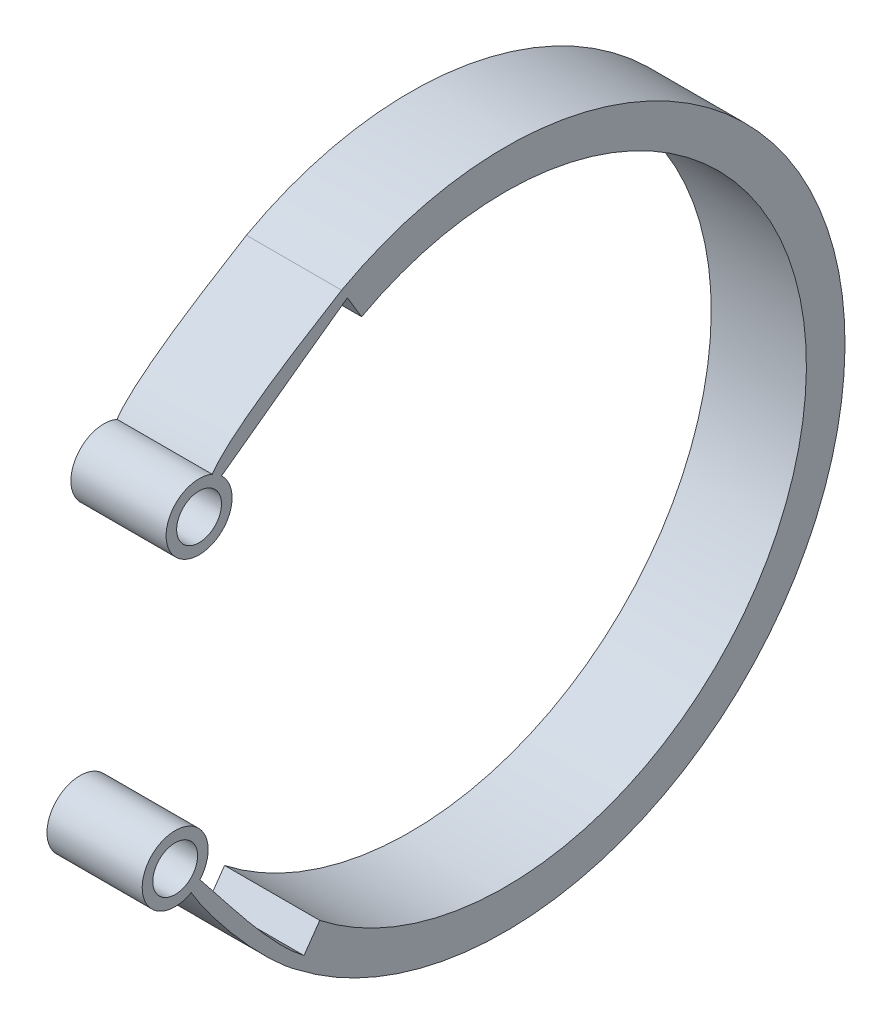
ISO-10303-21;
HEADER;
FILE_DESCRIPTION(('STEP AP214'),'2;1');
FILE_NAME('part.step','',(''),(''),'','','');
FILE_SCHEMA(('AUTOMOTIVE_DESIGN { 1 0 10303 214 1 1 1 1 }'));
ENDSEC;
DATA;
#1=APPLICATION_CONTEXT('core data for automotive mechanical design processes');
#2=APPLICATION_PROTOCOL_DEFINITION('international standard','automotive_design',2000,#1);
#3=PRODUCT_CONTEXT('',#1,'mechanical');
#4=PRODUCT('Part','Part','',(#3));
#5=PRODUCT_RELATED_PRODUCT_CATEGORY('part','',(#4));
#6=PRODUCT_DEFINITION_FORMATION('','',#4);
#7=PRODUCT_DEFINITION_CONTEXT('part definition',#1,'design');
#8=PRODUCT_DEFINITION('design','',#6,#7);
#9=PRODUCT_DEFINITION_SHAPE('','',#8);
#10=(LENGTH_UNIT() NAMED_UNIT(*) SI_UNIT(.MILLI.,.METRE.));
#11=(NAMED_UNIT(*) PLANE_ANGLE_UNIT() SI_UNIT($,.RADIAN.));
#12=(NAMED_UNIT(*) SI_UNIT($,.STERADIAN.) SOLID_ANGLE_UNIT());
#13=UNCERTAINTY_MEASURE_WITH_UNIT(LENGTH_MEASURE(1.E-05),#10,'distance_accuracy_value','');
#14=(GEOMETRIC_REPRESENTATION_CONTEXT(3) GLOBAL_UNCERTAINTY_ASSIGNED_CONTEXT((#13)) GLOBAL_UNIT_ASSIGNED_CONTEXT((#10,
#11,#12)) REPRESENTATION_CONTEXT('',''));
#15=CARTESIAN_POINT('',(0.,0.,0.));
#16=DIRECTION('',(0.,0.,1.));
#17=DIRECTION('',(1.,0.,0.));
#18=AXIS2_PLACEMENT_3D('',#15,#16,#17);
#19=CARTESIAN_POINT('',(11.43,0.,0.));
#20=DIRECTION('',(-1.,0.,0.));
#21=DIRECTION('',(0.,0.,1.));
#22=AXIS2_PLACEMENT_3D('',#19,#20,#21);
#23=PLANE('',#22);
#24=CARTESIAN_POINT('',(11.43,20.733511971356,36.7663508452583));
#25=DIRECTION('',(1.,0.,0.));
#26=DIRECTION('',(0.,0.,-1.));
#27=AXIS2_PLACEMENT_3D('',#24,#25,#26);
#28=CIRCLE('',#27,2.6924);
#29=CARTESIAN_POINT('',(11.43,20.733511971356,34.0739508452583));
#30=VERTEX_POINT('',#29);
#31=EDGE_CURVE('E207',#30,#30,#28,.T.);
#32=ORIENTED_EDGE('',*,*,#31,.F.);
#33=EDGE_LOOP('',(#32));
#34=FACE_BOUND('',#33,.T.);
#35=CARTESIAN_POINT('',(11.43,0.,0.));
#36=DIRECTION('',(-1.,0.,0.));
#37=DIRECTION('',(0.,0.,1.));
#38=AXIS2_PLACEMENT_3D('',#35,#36,#37);
#39=CIRCLE('',#38,36.1569);
#40=CARTESIAN_POINT('',(11.43,31.777583847616,17.2483791243622));
#41=VERTEX_POINT('',#40);
#42=CARTESIAN_POINT('',(11.43,-28.4795929210463,22.2763148806415));
#43=VERTEX_POINT('',#42);
#44=EDGE_CURVE('E202',#41,#43,#39,.T.);
#45=ORIENTED_EDGE('',*,*,#44,.T.);
#46=DIRECTION('',(0.,-0.818606248174084,0.574355125728281));
#47=VECTOR('',#46,1.);
#48=CARTESIAN_POINT('',(11.43,-31.1826307525171,24.1728355057963));
#49=LINE('',#48,#47);
#50=CARTESIAN_POINT('',(11.43,-31.1826307525171,24.1728355057963));
#51=VERTEX_POINT('',#50);
#52=EDGE_CURVE('E99',#43,#51,#49,.T.);
#53=ORIENTED_EDGE('',*,*,#52,.T.);
#54=CARTESIAN_POINT('',(11.43,-31.1826307525171,24.1728355057963));
#55=CARTESIAN_POINT('',(11.43,-28.091199741225,28.2478219612847));
#56=CARTESIAN_POINT('',(11.43,-21.8099591973757,32.8322033986307));
#57=CARTESIAN_POINT('',(11.43,-17.0412173589063,36.6690044107426));
#58=B_SPLINE_CURVE_WITH_KNOTS('',3,(#54,#55,#56,#57),.UNSPECIFIED.,.F.,.F.,(4,4),(0.,1.),.UNSPECIFIED.);
#59=CARTESIAN_POINT('',(11.43,-17.0412173589063,36.6690044107426));
#60=VERTEX_POINT('',#59);
#61=EDGE_CURVE('E193',#51,#60,#58,.T.);
#62=ORIENTED_EDGE('',*,*,#61,.T.);
#63=CARTESIAN_POINT('',(11.43,-14.4159842727607,39.6369607789203));
#64=DIRECTION('',(1.,0.,0.));
#65=DIRECTION('',(0.,0.,1.));
#66=AXIS2_PLACEMENT_3D('',#63,#64,#65);
#67=CIRCLE('',#66,3.9624);
#68=CARTESIAN_POINT('',(11.43,-17.8771420623821,37.7079712726391));
#69=VERTEX_POINT('',#68);
#70=EDGE_CURVE('E176',#60,#69,#67,.T.);
#71=ORIENTED_EDGE('',*,*,#70,.T.);
#72=CARTESIAN_POINT('',(11.43,-17.8771420623821,37.7079712726391));
#73=CARTESIAN_POINT('',(11.43,-22.1003604309631,35.2858135215405));
#74=CARTESIAN_POINT('',(11.43,-29.5016941579682,28.9000123398006));
#75=CARTESIAN_POINT('',(11.43,-32.2787879424064,24.9419274862461));
#76=B_SPLINE_CURVE_WITH_KNOTS('',3,(#72,#73,#74,#75),.UNSPECIFIED.,.F.,.F.,(4,4),(0.,1.),.UNSPECIFIED.);
#77=CARTESIAN_POINT('',(11.43,-32.2787879424064,24.9419274862462));
#78=VERTEX_POINT('',#77);
#79=EDGE_CURVE('E171',#69,#78,#76,.T.);
#80=ORIENTED_EDGE('',*,*,#79,.T.);
#81=CARTESIAN_POINT('',(11.43,0.,0.));
#82=DIRECTION('',(1.,0.,0.));
#83=DIRECTION('',(0.,0.,1.));
#84=AXIS2_PLACEMENT_3D('',#81,#82,#83);
#85=CIRCLE('',#84,40.7924);
#86=CARTESIAN_POINT('',(11.43,35.7445506081401,19.6557116274662));
#87=VERTEX_POINT('',#86);
#88=EDGE_CURVE('E166',#78,#87,#85,.T.);
#89=ORIENTED_EDGE('',*,*,#88,.T.);
#90=CARTESIAN_POINT('',(11.43,35.7445506081401,19.6557116274662));
#91=CARTESIAN_POINT('',(11.43,32.8334497548476,24.4528222495572));
#92=CARTESIAN_POINT('',(11.43,27.5420008076728,33.106842959707));
#93=CARTESIAN_POINT('',(11.43,24.3667500089187,35.1851503132552));
#94=B_SPLINE_CURVE_WITH_KNOTS('',3,(#90,#91,#92,#93),.UNSPECIFIED.,.F.,.F.,(4,4),(0.,1.),.UNSPECIFIED.);
#95=CARTESIAN_POINT('',(11.43,24.3667500089187,35.1851503132552));
#96=VERTEX_POINT('',#95);
#97=EDGE_CURVE('E124',#87,#96,#94,.T.);
#98=ORIENTED_EDGE('',*,*,#97,.T.);
#99=CARTESIAN_POINT('',(11.43,20.733511971356,36.7663508452583));
#100=DIRECTION('',(1.,0.,0.));
#101=DIRECTION('',(0.,0.,1.));
#102=AXIS2_PLACEMENT_3D('',#99,#100,#101);
#103=CIRCLE('',#102,3.9624);
#104=CARTESIAN_POINT('',(11.43,23.6364560008176,34.0694026214666));
#105=VERTEX_POINT('',#104);
#106=EDGE_CURVE('E118',#96,#105,#103,.T.);
#107=ORIENTED_EDGE('',*,*,#106,.T.);
#108=CARTESIAN_POINT('',(11.43,23.6364560008176,34.0694026214666));
#109=CARTESIAN_POINT('',(11.43,31.3331479952685,23.5805600001059));
#110=CARTESIAN_POINT('',(11.43,34.6004656098768,18.9614297821933));
#111=B_SPLINE_CURVE_WITH_KNOTS('',2,(#108,#109,#110),.UNSPECIFIED.,.F.,.F.,(3,3),(0.,1.),.UNSPECIFIED.);
#112=CARTESIAN_POINT('',(11.43,34.6004656098768,18.9614297821933));
#113=VERTEX_POINT('',#112);
#114=EDGE_CURVE('E122',#105,#113,#111,.T.);
#115=ORIENTED_EDGE('',*,*,#114,.T.);
#116=DIRECTION('',(0.,-0.854900594264318,-0.518791840651447));
#117=VECTOR('',#116,1.);
#118=CARTESIAN_POINT('',(11.43,31.777583847616,17.2483791243622));
#119=LINE('',#118,#117);
#120=EDGE_CURVE('E50',#113,#41,#119,.T.);
#121=ORIENTED_EDGE('',*,*,#120,.T.);
#122=EDGE_LOOP('',(#45,#53,#62,#71,#80,#89,#98,#107,#115,#121));
#123=FACE_BOUND('',#122,.T.);
#124=CARTESIAN_POINT('',(11.43,-14.4159842727607,39.6369607789203));
#125=DIRECTION('',(1.,0.,0.));
#126=DIRECTION('',(0.,0.,-1.));
#127=AXIS2_PLACEMENT_3D('',#124,#125,#126);
#128=CIRCLE('',#127,2.6924);
#129=CARTESIAN_POINT('',(11.43,-14.4159842727607,36.9445607789203));
#130=VERTEX_POINT('',#129);
#131=EDGE_CURVE('E208',#130,#130,#128,.T.);
#132=ORIENTED_EDGE('',*,*,#131,.F.);
#133=EDGE_LOOP('',(#132));
#134=FACE_BOUND('',#133,.T.);
#135=ADVANCED_FACE('F33',(#34,#123,#134),#23,.F.);
#136=CARTESIAN_POINT('',(0.,0.,0.));
#137=DIRECTION('',(-1.,0.,0.));
#138=DIRECTION('',(0.,0.,1.));
#139=AXIS2_PLACEMENT_3D('',#136,#137,#138);
#140=PLANE('',#139);
#141=CARTESIAN_POINT('',(0.,20.733511971356,36.7663508452583));
#142=DIRECTION('',(1.,0.,0.));
#143=DIRECTION('',(0.,0.,-1.));
#144=AXIS2_PLACEMENT_3D('',#141,#142,#143);
#145=CIRCLE('',#144,2.6924);
#146=CARTESIAN_POINT('',(0.,20.733511971356,34.0739508452583));
#147=VERTEX_POINT('',#146);
#148=EDGE_CURVE('E204',#147,#147,#145,.T.);
#149=ORIENTED_EDGE('',*,*,#148,.T.);
#150=EDGE_LOOP('',(#149));
#151=FACE_BOUND('',#150,.T.);
#152=CARTESIAN_POINT('',(0.,0.,0.));
#153=DIRECTION('',(-1.,0.,0.));
#154=DIRECTION('',(0.,0.,1.));
#155=AXIS2_PLACEMENT_3D('',#152,#153,#154);
#156=CIRCLE('',#155,36.1569);
#157=CARTESIAN_POINT('',(0.,31.777583847616,17.2483791243622));
#158=VERTEX_POINT('',#157);
#159=CARTESIAN_POINT('',(0.,-28.4795929210463,22.2763148806415));
#160=VERTEX_POINT('',#159);
#161=EDGE_CURVE('E211',#158,#160,#156,.T.);
#162=ORIENTED_EDGE('',*,*,#161,.F.);
#163=DIRECTION('',(0.,-0.854900594264318,-0.518791840651447));
#164=VECTOR('',#163,1.);
#165=CARTESIAN_POINT('',(0.,31.777583847616,17.2483791243622));
#166=LINE('',#165,#164);
#167=CARTESIAN_POINT('',(0.,34.6004656098768,18.9614297821933));
#168=VERTEX_POINT('',#167);
#169=EDGE_CURVE('E91',#168,#158,#166,.T.);
#170=ORIENTED_EDGE('',*,*,#169,.F.);
#171=CARTESIAN_POINT('',(0.,23.6364560008176,34.0694026214666));
#172=CARTESIAN_POINT('',(0.,31.3331479952685,23.5805600001059));
#173=CARTESIAN_POINT('',(0.,34.6004656098768,18.9614297821933));
#174=B_SPLINE_CURVE_WITH_KNOTS('',2,(#171,#172,#173),.UNSPECIFIED.,.F.,.F.,(3,3),(0.,1.),.UNSPECIFIED.);
#175=CARTESIAN_POINT('',(0.,23.6364560008176,34.0694026214666));
#176=VERTEX_POINT('',#175);
#177=EDGE_CURVE('E85',#176,#168,#174,.T.);
#178=ORIENTED_EDGE('',*,*,#177,.F.);
#179=CARTESIAN_POINT('',(0.,20.733511971356,36.7663508452583));
#180=DIRECTION('',(1.,0.,0.));
#181=DIRECTION('',(0.,0.,1.));
#182=AXIS2_PLACEMENT_3D('',#179,#180,#181);
#183=CIRCLE('',#182,3.9624);
#184=CARTESIAN_POINT('',(0.,24.3667500089187,35.1851503132552));
#185=VERTEX_POINT('',#184);
#186=EDGE_CURVE('E132',#185,#176,#183,.T.);
#187=ORIENTED_EDGE('',*,*,#186,.F.);
#188=CARTESIAN_POINT('',(0.,35.7445506081401,19.6557116274662));
#189=CARTESIAN_POINT('',(0.,32.8334497548476,24.4528222495572));
#190=CARTESIAN_POINT('',(0.,27.5420008076728,33.106842959707));
#191=CARTESIAN_POINT('',(0.,24.3667500089187,35.1851503132552));
#192=B_SPLINE_CURVE_WITH_KNOTS('',3,(#188,#189,#190,#191),.UNSPECIFIED.,.F.,.F.,(4,4),(0.,1.),.UNSPECIFIED.);
#193=CARTESIAN_POINT('',(0.,35.7445506081401,19.6557116274662));
#194=VERTEX_POINT('',#193);
#195=EDGE_CURVE('E349',#194,#185,#192,.T.);
#196=ORIENTED_EDGE('',*,*,#195,.F.);
#197=CARTESIAN_POINT('',(0.,0.,0.));
#198=DIRECTION('',(1.,0.,0.));
#199=DIRECTION('',(0.,0.,1.));
#200=AXIS2_PLACEMENT_3D('',#197,#198,#199);
#201=CIRCLE('',#200,40.7924);
#202=CARTESIAN_POINT('',(0.,-32.2787879424064,24.9419274862462));
#203=VERTEX_POINT('',#202);
#204=EDGE_CURVE('E344',#203,#194,#201,.T.);
#205=ORIENTED_EDGE('',*,*,#204,.F.);
#206=CARTESIAN_POINT('',(0.,-17.8771420623821,37.7079712726391));
#207=CARTESIAN_POINT('',(0.,-22.1003604309631,35.2858135215405));
#208=CARTESIAN_POINT('',(0.,-29.5016941579682,28.9000123398006));
#209=CARTESIAN_POINT('',(0.,-32.2787879424064,24.9419274862461));
#210=B_SPLINE_CURVE_WITH_KNOTS('',3,(#206,#207,#208,#209),.UNSPECIFIED.,.F.,.F.,(4,4),(0.,1.),.UNSPECIFIED.);
#211=CARTESIAN_POINT('',(0.,-17.8771420623821,37.7079712726391));
#212=VERTEX_POINT('',#211);
#213=EDGE_CURVE('E340',#212,#203,#210,.T.);
#214=ORIENTED_EDGE('',*,*,#213,.F.);
#215=CARTESIAN_POINT('',(0.,-14.4159842727607,39.6369607789203));
#216=DIRECTION('',(1.,0.,0.));
#217=DIRECTION('',(0.,0.,1.));
#218=AXIS2_PLACEMENT_3D('',#215,#216,#217);
#219=CIRCLE('',#218,3.9624);
#220=CARTESIAN_POINT('',(0.,-17.0412173589063,36.6690044107426));
#221=VERTEX_POINT('',#220);
#222=EDGE_CURVE('E335',#221,#212,#219,.T.);
#223=ORIENTED_EDGE('',*,*,#222,.F.);
#224=CARTESIAN_POINT('',(0.,-31.1826307525171,24.1728355057963));
#225=CARTESIAN_POINT('',(0.,-28.091199741225,28.2478219612847));
#226=CARTESIAN_POINT('',(0.,-21.8099591973757,32.8322033986307));
#227=CARTESIAN_POINT('',(0.,-17.0412173589063,36.6690044107426));
#228=B_SPLINE_CURVE_WITH_KNOTS('',3,(#224,#225,#226,#227),.UNSPECIFIED.,.F.,.F.,(4,4),(0.,1.),.UNSPECIFIED.);
#229=CARTESIAN_POINT('',(0.,-31.1826307525171,24.1728355057963));
#230=VERTEX_POINT('',#229);
#231=EDGE_CURVE('E329',#230,#221,#228,.T.);
#232=ORIENTED_EDGE('',*,*,#231,.F.);
#233=DIRECTION('',(0.,-0.818606248174084,0.574355125728281));
#234=VECTOR('',#233,1.);
#235=CARTESIAN_POINT('',(0.,-31.1826307525171,24.1728355057963));
#236=LINE('',#235,#234);
#237=EDGE_CURVE('E328',#160,#230,#236,.T.);
#238=ORIENTED_EDGE('',*,*,#237,.F.);
#239=EDGE_LOOP('',(#162,#170,#178,#187,#196,#205,#214,#223,#232,#238));
#240=FACE_BOUND('',#239,.T.);
#241=CARTESIAN_POINT('',(0.,-14.4159842727607,39.6369607789203));
#242=DIRECTION('',(1.,0.,0.));
#243=DIRECTION('',(0.,0.,-1.));
#244=AXIS2_PLACEMENT_3D('',#241,#242,#243);
#245=CIRCLE('',#244,2.6924);
#246=CARTESIAN_POINT('',(0.,-14.4159842727607,36.9445607789203));
#247=VERTEX_POINT('',#246);
#248=EDGE_CURVE('E212',#247,#247,#245,.T.);
#249=ORIENTED_EDGE('',*,*,#248,.T.);
#250=EDGE_LOOP('',(#249));
#251=FACE_BOUND('',#250,.T.);
#252=ADVANCED_FACE('F221',(#151,#240,#251),#140,.T.);
#253=CARTESIAN_POINT('',(11.43,0.,0.));
#254=DIRECTION('',(-1.,0.,0.));
#255=DIRECTION('',(0.,0.,1.));
#256=AXIS2_PLACEMENT_3D('',#253,#254,#255);
#257=CYLINDRICAL_SURFACE('',#256,36.1569);
#258=ORIENTED_EDGE('',*,*,#161,.T.);
#259=DIRECTION('',(-1.,0.,0.));
#260=VECTOR('',#259,1.);
#261=CARTESIAN_POINT('',(11.43,-28.4795929210463,22.2763148806415));
#262=LINE('',#261,#260);
#263=EDGE_CURVE('E11',#43,#160,#262,.T.);
#264=ORIENTED_EDGE('',*,*,#263,.F.);
#265=ORIENTED_EDGE('',*,*,#44,.F.);
#266=DIRECTION('',(-1.,0.,0.));
#267=VECTOR('',#266,1.);
#268=CARTESIAN_POINT('',(11.43,31.777583847616,17.2483791243622));
#269=LINE('',#268,#267);
#270=EDGE_CURVE('E138',#41,#158,#269,.T.);
#271=ORIENTED_EDGE('',*,*,#270,.T.);
#272=EDGE_LOOP('',(#258,#264,#265,#271));
#273=FACE_BOUND('',#272,.T.);
#274=ADVANCED_FACE('F35',(#273),#257,.F.);
#275=CARTESIAN_POINT('',(11.43,-31.1826307525171,24.1728355057963));
#276=DIRECTION('',(0.,-0.574355125728281,-0.818606248174084));
#277=DIRECTION('',(0.,0.818606248174084,-0.574355125728281));
#278=AXIS2_PLACEMENT_3D('',#275,#276,#277);
#279=PLANE('',#278);
#280=ORIENTED_EDGE('',*,*,#237,.T.);
#281=DIRECTION('',(-1.,0.,0.));
#282=VECTOR('',#281,1.);
#283=CARTESIAN_POINT('',(11.43,-31.1826307525171,24.1728355057963));
#284=LINE('',#283,#282);
#285=EDGE_CURVE('E42',#51,#230,#284,.T.);
#286=ORIENTED_EDGE('',*,*,#285,.F.);
#287=ORIENTED_EDGE('',*,*,#52,.F.);
#288=ORIENTED_EDGE('',*,*,#263,.T.);
#289=EDGE_LOOP('',(#280,#286,#287,#288));
#290=FACE_BOUND('',#289,.T.);
#291=ADVANCED_FACE('F191',(#290),#279,.F.);
#292=DIRECTION('',(-1.,0.,0.));
#293=VECTOR('',#292,1.);
#294=SURFACE_OF_LINEAR_EXTRUSION('',#58,#293);
#295=ORIENTED_EDGE('',*,*,#231,.T.);
#296=DIRECTION('',(-1.,0.,0.));
#297=VECTOR('',#296,1.);
#298=CARTESIAN_POINT('',(11.43,-17.0412173589063,36.6690044107426));
#299=LINE('',#298,#297);
#300=EDGE_CURVE('E376',#60,#221,#299,.T.);
#301=ORIENTED_EDGE('',*,*,#300,.F.);
#302=ORIENTED_EDGE('',*,*,#61,.F.);
#303=ORIENTED_EDGE('',*,*,#285,.T.);
#304=EDGE_LOOP('',(#295,#301,#302,#303));
#305=FACE_BOUND('',#304,.T.);
#306=ADVANCED_FACE('F188',(#305),#294,.F.);
#307=CARTESIAN_POINT('',(11.43,-14.4159842727607,39.6369607789203));
#308=DIRECTION('',(-1.,0.,0.));
#309=DIRECTION('',(0.,0.,1.));
#310=AXIS2_PLACEMENT_3D('',#307,#308,#309);
#311=CYLINDRICAL_SURFACE('',#310,3.9624);
#312=ORIENTED_EDGE('',*,*,#222,.T.);
#313=DIRECTION('',(-1.,0.,0.));
#314=VECTOR('',#313,1.);
#315=CARTESIAN_POINT('',(11.43,-17.8771420623821,37.7079712726391));
#316=LINE('',#315,#314);
#317=EDGE_CURVE('E373',#69,#212,#316,.T.);
#318=ORIENTED_EDGE('',*,*,#317,.F.);
#319=ORIENTED_EDGE('',*,*,#70,.F.);
#320=ORIENTED_EDGE('',*,*,#300,.T.);
#321=EDGE_LOOP('',(#312,#318,#319,#320));
#322=FACE_BOUND('',#321,.T.);
#323=ADVANCED_FACE('F184',(#322),#311,.T.);
#324=DIRECTION('',(-1.,0.,0.));
#325=VECTOR('',#324,1.);
#326=SURFACE_OF_LINEAR_EXTRUSION('',#76,#325);
#327=ORIENTED_EDGE('',*,*,#213,.T.);
#328=DIRECTION('',(-1.,0.,0.));
#329=VECTOR('',#328,1.);
#330=CARTESIAN_POINT('',(11.43,-32.2787879424064,24.9419274862462));
#331=LINE('',#330,#329);
#332=EDGE_CURVE('E370',#78,#203,#331,.T.);
#333=ORIENTED_EDGE('',*,*,#332,.F.);
#334=ORIENTED_EDGE('',*,*,#79,.F.);
#335=ORIENTED_EDGE('',*,*,#317,.T.);
#336=EDGE_LOOP('',(#327,#333,#334,#335));
#337=FACE_BOUND('',#336,.T.);
#338=ADVANCED_FACE('F181',(#337),#326,.F.);
#339=CARTESIAN_POINT('',(11.43,0.,0.));
#340=DIRECTION('',(-1.,0.,0.));
#341=DIRECTION('',(0.,0.,1.));
#342=AXIS2_PLACEMENT_3D('',#339,#340,#341);
#343=CYLINDRICAL_SURFACE('',#342,40.7924);
#344=ORIENTED_EDGE('',*,*,#204,.T.);
#345=DIRECTION('',(-1.,0.,0.));
#346=VECTOR('',#345,1.);
#347=CARTESIAN_POINT('',(11.43,35.7445506081401,19.6557116274662));
#348=LINE('',#347,#346);
#349=EDGE_CURVE('E367',#87,#194,#348,.T.);
#350=ORIENTED_EDGE('',*,*,#349,.F.);
#351=ORIENTED_EDGE('',*,*,#88,.F.);
#352=ORIENTED_EDGE('',*,*,#332,.T.);
#353=EDGE_LOOP('',(#344,#350,#351,#352));
#354=FACE_BOUND('',#353,.T.);
#355=ADVANCED_FACE('F159',(#354),#343,.T.);
#356=DIRECTION('',(-1.,0.,0.));
#357=VECTOR('',#356,1.);
#358=SURFACE_OF_LINEAR_EXTRUSION('',#94,#357);
#359=ORIENTED_EDGE('',*,*,#195,.T.);
#360=DIRECTION('',(-1.,0.,0.));
#361=VECTOR('',#360,1.);
#362=CARTESIAN_POINT('',(11.43,24.3667500089187,35.1851503132552));
#363=LINE('',#362,#361);
#364=EDGE_CURVE('E133',#96,#185,#363,.T.);
#365=ORIENTED_EDGE('',*,*,#364,.F.);
#366=ORIENTED_EDGE('',*,*,#97,.F.);
#367=ORIENTED_EDGE('',*,*,#349,.T.);
#368=EDGE_LOOP('',(#359,#365,#366,#367));
#369=FACE_BOUND('',#368,.T.);
#370=ADVANCED_FACE('F156',(#369),#358,.F.);
#371=CARTESIAN_POINT('',(11.43,20.733511971356,36.7663508452583));
#372=DIRECTION('',(-1.,0.,0.));
#373=DIRECTION('',(0.,0.,1.));
#374=AXIS2_PLACEMENT_3D('',#371,#372,#373);
#375=CYLINDRICAL_SURFACE('',#374,3.9624);
#376=ORIENTED_EDGE('',*,*,#186,.T.);
#377=DIRECTION('',(-1.,0.,0.));
#378=VECTOR('',#377,1.);
#379=CARTESIAN_POINT('',(11.43,23.6364560008176,34.0694026214666));
#380=LINE('',#379,#378);
#381=EDGE_CURVE('E129',#105,#176,#380,.T.);
#382=ORIENTED_EDGE('',*,*,#381,.F.);
#383=ORIENTED_EDGE('',*,*,#106,.F.);
#384=ORIENTED_EDGE('',*,*,#364,.T.);
#385=EDGE_LOOP('',(#376,#382,#383,#384));
#386=FACE_BOUND('',#385,.T.);
#387=ADVANCED_FACE('F130',(#386),#375,.T.);
#388=DIRECTION('',(-1.,0.,0.));
#389=VECTOR('',#388,1.);
#390=SURFACE_OF_LINEAR_EXTRUSION('',#111,#389);
#391=ORIENTED_EDGE('',*,*,#177,.T.);
#392=DIRECTION('',(-1.,0.,0.));
#393=VECTOR('',#392,1.);
#394=CARTESIAN_POINT('',(11.43,34.6004656098768,18.9614297821933));
#395=LINE('',#394,#393);
#396=EDGE_CURVE('E134',#113,#168,#395,.T.);
#397=ORIENTED_EDGE('',*,*,#396,.F.);
#398=ORIENTED_EDGE('',*,*,#114,.F.);
#399=ORIENTED_EDGE('',*,*,#381,.T.);
#400=EDGE_LOOP('',(#391,#397,#398,#399));
#401=FACE_BOUND('',#400,.T.);
#402=ADVANCED_FACE('F136',(#401),#390,.F.);
#403=CARTESIAN_POINT('',(11.43,31.777583847616,17.2483791243622));
#404=DIRECTION('',(0.,0.518791840651447,-0.854900594264318));
#405=DIRECTION('',(0.,0.854900594264318,0.518791840651447));
#406=AXIS2_PLACEMENT_3D('',#403,#404,#405);
#407=PLANE('',#406);
#408=ORIENTED_EDGE('',*,*,#169,.T.);
#409=ORIENTED_EDGE('',*,*,#270,.F.);
#410=ORIENTED_EDGE('',*,*,#120,.F.);
#411=ORIENTED_EDGE('',*,*,#396,.T.);
#412=EDGE_LOOP('',(#408,#409,#410,#411));
#413=FACE_BOUND('',#412,.T.);
#414=ADVANCED_FACE('F152',(#413),#407,.F.);
#415=CARTESIAN_POINT('',(11.43,20.733511971356,36.7663508452583));
#416=DIRECTION('',(-1.,0.,0.));
#417=DIRECTION('',(0.,0.,1.));
#418=AXIS2_PLACEMENT_3D('',#415,#416,#417);
#419=CYLINDRICAL_SURFACE('',#418,2.6924);
#420=ORIENTED_EDGE('',*,*,#31,.T.);
#421=EDGE_LOOP('',(#420));
#422=FACE_BOUND('',#421,.T.);
#423=ORIENTED_EDGE('',*,*,#148,.F.);
#424=EDGE_LOOP('',(#423));
#425=FACE_BOUND('',#424,.T.);
#426=ADVANCED_FACE('F230',(#422,#425),#419,.F.);
#427=CARTESIAN_POINT('',(11.43,-14.4159842727607,39.6369607789203));
#428=DIRECTION('',(-1.,0.,0.));
#429=DIRECTION('',(0.,0.,1.));
#430=AXIS2_PLACEMENT_3D('',#427,#428,#429);
#431=CYLINDRICAL_SURFACE('',#430,2.6924);
#432=ORIENTED_EDGE('',*,*,#131,.T.);
#433=EDGE_LOOP('',(#432));
#434=FACE_BOUND('',#433,.T.);
#435=ORIENTED_EDGE('',*,*,#248,.F.);
#436=EDGE_LOOP('',(#435));
#437=FACE_BOUND('',#436,.T.);
#438=ADVANCED_FACE('F218',(#434,#437),#431,.F.);
#439=CLOSED_SHELL('',(#135,#252,#274,#291,#306,#323,#338,#355,#370,#387,#402,#414,#426,#438));
#440=MANIFOLD_SOLID_BREP('B2',#439);
#441=ADVANCED_BREP_SHAPE_REPRESENTATION('',(#18,#440),#14);
#442=SHAPE_DEFINITION_REPRESENTATION(#9,#441);
ENDSEC;
END-ISO-10303-21;
